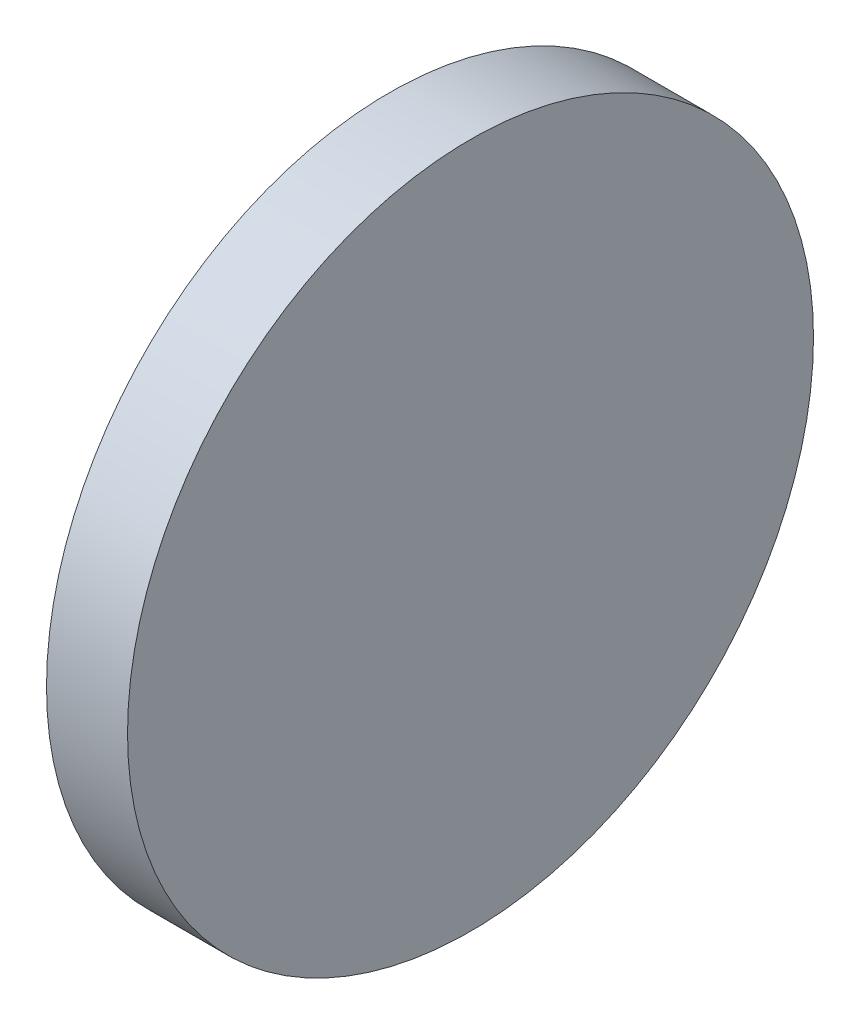
ISO-10303-21;
HEADER;
FILE_DESCRIPTION(('STEP AP214'),'2;1');
FILE_NAME('part.step','',(''),(''),'','','');
FILE_SCHEMA(('AUTOMOTIVE_DESIGN { 1 0 10303 214 1 1 1 1 }'));
ENDSEC;
DATA;
#1=APPLICATION_CONTEXT('core data for automotive mechanical design processes');
#2=APPLICATION_PROTOCOL_DEFINITION('international standard','automotive_design',2000,#1);
#3=PRODUCT_CONTEXT('',#1,'mechanical');
#4=PRODUCT('Part','Part','',(#3));
#5=PRODUCT_RELATED_PRODUCT_CATEGORY('part','',(#4));
#6=PRODUCT_DEFINITION_FORMATION('','',#4);
#7=PRODUCT_DEFINITION_CONTEXT('part definition',#1,'design');
#8=PRODUCT_DEFINITION('design','',#6,#7);
#9=PRODUCT_DEFINITION_SHAPE('','',#8);
#10=(LENGTH_UNIT() NAMED_UNIT(*) SI_UNIT(.MILLI.,.METRE.));
#11=(NAMED_UNIT(*) PLANE_ANGLE_UNIT() SI_UNIT($,.RADIAN.));
#12=(NAMED_UNIT(*) SI_UNIT($,.STERADIAN.) SOLID_ANGLE_UNIT());
#13=UNCERTAINTY_MEASURE_WITH_UNIT(LENGTH_MEASURE(1.E-05),#10,'distance_accuracy_value','');
#14=(GEOMETRIC_REPRESENTATION_CONTEXT(3) GLOBAL_UNCERTAINTY_ASSIGNED_CONTEXT((#13)) GLOBAL_UNIT_ASSIGNED_CONTEXT((#10,
#11,#12)) REPRESENTATION_CONTEXT('',''));
#15=CARTESIAN_POINT('',(0.,0.,0.));
#16=DIRECTION('',(0.,0.,1.));
#17=DIRECTION('',(1.,0.,0.));
#18=AXIS2_PLACEMENT_3D('',#15,#16,#17);
#19=CARTESIAN_POINT('',(168.7,25.4,0.));
#20=DIRECTION('',(1.,0.,0.));
#21=DIRECTION('',(0.,0.,-1.));
#22=AXIS2_PLACEMENT_3D('',#19,#20,#21);
#23=PLANE('',#22);
#24=CARTESIAN_POINT('',(168.7,0.,0.));
#25=DIRECTION('',(-1.,0.,0.));
#26=DIRECTION('',(0.,0.,1.));
#27=AXIS2_PLACEMENT_3D('',#24,#25,#26);
#28=CIRCLE('',#27,25.4);
#29=CARTESIAN_POINT('',(168.7,0.,25.4));
#30=VERTEX_POINT('',#29);
#31=EDGE_CURVE('E37',#30,#30,#28,.T.);
#32=ORIENTED_EDGE('',*,*,#31,.T.);
#33=EDGE_LOOP('',(#32));
#34=FACE_BOUND('',#33,.T.);
#35=ADVANCED_FACE('F31',(#34),#23,.F.);
#36=CARTESIAN_POINT('',(174.7,0.,0.));
#37=DIRECTION('',(-1.,0.,0.));
#38=DIRECTION('',(0.,0.,1.));
#39=AXIS2_PLACEMENT_3D('',#36,#37,#38);
#40=PLANE('',#39);
#41=CARTESIAN_POINT('',(174.7,0.,0.));
#42=DIRECTION('',(-1.,0.,0.));
#43=DIRECTION('',(0.,0.,1.));
#44=AXIS2_PLACEMENT_3D('',#41,#42,#43);
#45=CIRCLE('',#44,25.4);
#46=CARTESIAN_POINT('',(174.7,0.,25.4));
#47=VERTEX_POINT('',#46);
#48=EDGE_CURVE('E10',#47,#47,#45,.T.);
#49=ORIENTED_EDGE('',*,*,#48,.F.);
#50=EDGE_LOOP('',(#49));
#51=FACE_BOUND('',#50,.T.);
#52=ADVANCED_FACE('F46',(#51),#40,.F.);
#53=CARTESIAN_POINT('',(-110.,0.,0.));
#54=DIRECTION('',(-1.,0.,0.));
#55=DIRECTION('',(0.,0.,1.));
#56=AXIS2_PLACEMENT_3D('',#53,#54,#55);
#57=CYLINDRICAL_SURFACE('',#56,25.4);
#58=ORIENTED_EDGE('',*,*,#31,.F.);
#59=EDGE_LOOP('',(#58));
#60=FACE_BOUND('',#59,.T.);
#61=ORIENTED_EDGE('',*,*,#48,.T.);
#62=EDGE_LOOP('',(#61));
#63=FACE_BOUND('',#62,.T.);
#64=ADVANCED_FACE('F44',(#60,#63),#57,.T.);
#65=CLOSED_SHELL('',(#35,#52,#64));
#66=MANIFOLD_SOLID_BREP('B2',#65);
#67=ADVANCED_BREP_SHAPE_REPRESENTATION('',(#18,#66),#14);
#68=SHAPE_DEFINITION_REPRESENTATION(#9,#67);
ENDSEC;
END-ISO-10303-21;
